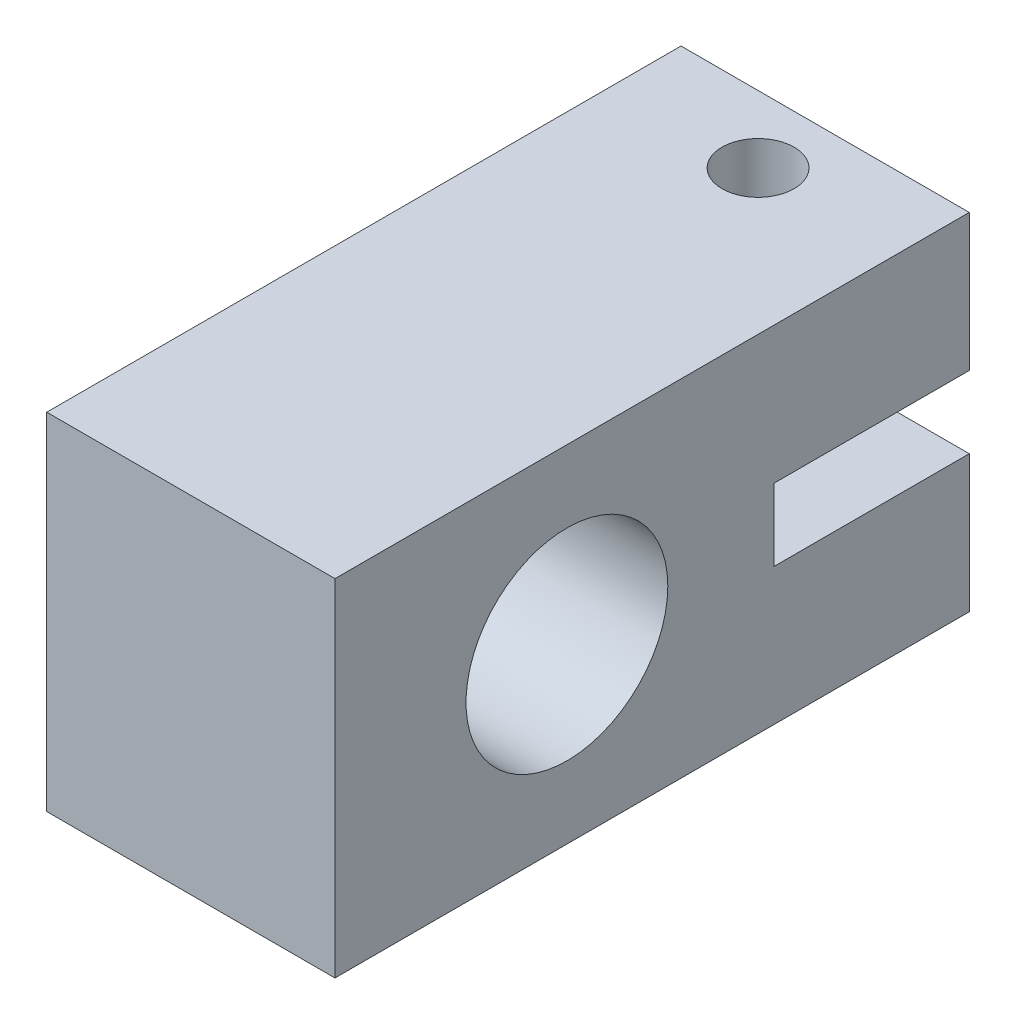
ISO-10303-21;
HEADER;
FILE_DESCRIPTION(('STEP AP214'),'2;1');
FILE_NAME('part.step','',(''),(''),'','','');
FILE_SCHEMA(('AUTOMOTIVE_DESIGN { 1 0 10303 214 1 1 1 1 }'));
ENDSEC;
DATA;
#1=APPLICATION_CONTEXT('core data for automotive mechanical design processes');
#2=APPLICATION_PROTOCOL_DEFINITION('international standard','automotive_design',2000,#1);
#3=PRODUCT_CONTEXT('',#1,'mechanical');
#4=PRODUCT('Part','Part','',(#3));
#5=PRODUCT_RELATED_PRODUCT_CATEGORY('part','',(#4));
#6=PRODUCT_DEFINITION_FORMATION('','',#4);
#7=PRODUCT_DEFINITION_CONTEXT('part definition',#1,'design');
#8=PRODUCT_DEFINITION('design','',#6,#7);
#9=PRODUCT_DEFINITION_SHAPE('','',#8);
#10=(LENGTH_UNIT() NAMED_UNIT(*) SI_UNIT(.MILLI.,.METRE.));
#11=(NAMED_UNIT(*) PLANE_ANGLE_UNIT() SI_UNIT($,.RADIAN.));
#12=(NAMED_UNIT(*) SI_UNIT($,.STERADIAN.) SOLID_ANGLE_UNIT());
#13=UNCERTAINTY_MEASURE_WITH_UNIT(LENGTH_MEASURE(1.E-05),#10,'distance_accuracy_value','');
#14=(GEOMETRIC_REPRESENTATION_CONTEXT(3) GLOBAL_UNCERTAINTY_ASSIGNED_CONTEXT((#13)) GLOBAL_UNIT_ASSIGNED_CONTEXT((#10,
#11,#12)) REPRESENTATION_CONTEXT('',''));
#15=CARTESIAN_POINT('',(0.,0.,0.));
#16=DIRECTION('',(0.,0.,1.));
#17=DIRECTION('',(1.,0.,0.));
#18=AXIS2_PLACEMENT_3D('',#15,#16,#17);
#19=CARTESIAN_POINT('',(20.,-12.,-27.9165466800982));
#20=DIRECTION('',(1.,0.,0.));
#21=DIRECTION('',(0.,0.,-1.));
#22=AXIS2_PLACEMENT_3D('',#19,#20,#21);
#23=PLANE('',#22);
#24=DIRECTION('',(0.,1.,0.));
#25=VECTOR('',#24,1.);
#26=CARTESIAN_POINT('',(20.,-2.5,-27.9165466800982));
#27=LINE('',#26,#25);
#28=CARTESIAN_POINT('',(20.,-12.,-27.9165466800982));
#29=VERTEX_POINT('',#28);
#30=CARTESIAN_POINT('',(20.,-2.5,-27.9165466800982));
#31=VERTEX_POINT('',#30);
#32=EDGE_CURVE('E143',#29,#31,#27,.T.);
#33=ORIENTED_EDGE('',*,*,#32,.T.);
#34=DIRECTION('',(0.,0.,1.));
#35=VECTOR('',#34,1.);
#36=CARTESIAN_POINT('',(20.,-2.5,-14.3714749567564));
#37=LINE('',#36,#35);
#38=CARTESIAN_POINT('',(20.,-2.5,-14.3714749567564));
#39=VERTEX_POINT('',#38);
#40=EDGE_CURVE('E91',#31,#39,#37,.T.);
#41=ORIENTED_EDGE('',*,*,#40,.T.);
#42=DIRECTION('',(0.,1.,0.));
#43=VECTOR('',#42,1.);
#44=CARTESIAN_POINT('',(20.,2.5,-14.3714749567564));
#45=LINE('',#44,#43);
#46=CARTESIAN_POINT('',(20.,2.5,-14.3714749567564));
#47=VERTEX_POINT('',#46);
#48=EDGE_CURVE('E158',#39,#47,#45,.T.);
#49=ORIENTED_EDGE('',*,*,#48,.T.);
#50=DIRECTION('',(0.,0.,-1.));
#51=VECTOR('',#50,1.);
#52=CARTESIAN_POINT('',(20.,2.5,-14.3714749567564));
#53=LINE('',#52,#51);
#54=CARTESIAN_POINT('',(20.,2.5,-27.9165466800982));
#55=VERTEX_POINT('',#54);
#56=EDGE_CURVE('E171',#47,#55,#53,.T.);
#57=ORIENTED_EDGE('',*,*,#56,.T.);
#58=DIRECTION('',(0.,1.,0.));
#59=VECTOR('',#58,1.);
#60=CARTESIAN_POINT('',(20.,12.,-27.9165466800982));
#61=LINE('',#60,#59);
#62=CARTESIAN_POINT('',(20.,12.,-27.9165466800982));
#63=VERTEX_POINT('',#62);
#64=EDGE_CURVE('E110',#55,#63,#61,.T.);
#65=ORIENTED_EDGE('',*,*,#64,.T.);
#66=DIRECTION('',(0.,0.,1.));
#67=VECTOR('',#66,1.);
#68=CARTESIAN_POINT('',(20.,12.,16.0933971814075));
#69=LINE('',#68,#67);
#70=CARTESIAN_POINT('',(20.,12.,16.0933971814075));
#71=VERTEX_POINT('',#70);
#72=EDGE_CURVE('E104',#63,#71,#69,.T.);
#73=ORIENTED_EDGE('',*,*,#72,.T.);
#74=DIRECTION('',(0.,-1.,0.));
#75=VECTOR('',#74,1.);
#76=CARTESIAN_POINT('',(20.,12.,16.0933971814075));
#77=LINE('',#76,#75);
#78=CARTESIAN_POINT('',(20.,-12.,16.0933971814075));
#79=VERTEX_POINT('',#78);
#80=EDGE_CURVE('E108',#71,#79,#77,.T.);
#81=ORIENTED_EDGE('',*,*,#80,.T.);
#82=DIRECTION('',(0.,0.,-1.));
#83=VECTOR('',#82,1.);
#84=CARTESIAN_POINT('',(20.,-12.,16.0933971814075));
#85=LINE('',#84,#83);
#86=EDGE_CURVE('E48',#79,#29,#85,.T.);
#87=ORIENTED_EDGE('',*,*,#86,.T.);
#88=EDGE_LOOP('',(#33,#41,#49,#57,#65,#73,#81,#87));
#89=FACE_BOUND('',#88,.T.);
#90=CARTESIAN_POINT('',(20.,0.,0.));
#91=DIRECTION('',(1.,0.,0.));
#92=DIRECTION('',(0.,0.,-1.));
#93=AXIS2_PLACEMENT_3D('',#90,#91,#92);
#94=CIRCLE('',#93,7.);
#95=CARTESIAN_POINT('',(20.,0.,-7.));
#96=VERTEX_POINT('',#95);
#97=EDGE_CURVE('E132',#96,#96,#94,.T.);
#98=ORIENTED_EDGE('',*,*,#97,.F.);
#99=EDGE_LOOP('',(#98));
#100=FACE_BOUND('',#99,.T.);
#101=ADVANCED_FACE('F31',(#89,#100),#23,.T.);
#102=CARTESIAN_POINT('',(0.,-12.,-27.9165466800982));
#103=DIRECTION('',(1.,0.,0.));
#104=DIRECTION('',(0.,0.,-1.));
#105=AXIS2_PLACEMENT_3D('',#102,#103,#104);
#106=PLANE('',#105);
#107=DIRECTION('',(0.,1.,0.));
#108=VECTOR('',#107,1.);
#109=CARTESIAN_POINT('',(0.,-2.5,-27.9165466800982));
#110=LINE('',#109,#108);
#111=CARTESIAN_POINT('',(0.,-12.,-27.9165466800982));
#112=VERTEX_POINT('',#111);
#113=CARTESIAN_POINT('',(0.,-2.5,-27.9165466800982));
#114=VERTEX_POINT('',#113);
#115=EDGE_CURVE('E128',#112,#114,#110,.T.);
#116=ORIENTED_EDGE('',*,*,#115,.F.);
#117=DIRECTION('',(0.,0.,-1.));
#118=VECTOR('',#117,1.);
#119=CARTESIAN_POINT('',(0.,-12.,16.0933971814075));
#120=LINE('',#119,#118);
#121=CARTESIAN_POINT('',(0.,-12.,16.0933971814075));
#122=VERTEX_POINT('',#121);
#123=EDGE_CURVE('E83',#122,#112,#120,.T.);
#124=ORIENTED_EDGE('',*,*,#123,.F.);
#125=DIRECTION('',(0.,-1.,0.));
#126=VECTOR('',#125,1.);
#127=CARTESIAN_POINT('',(0.,12.,16.0933971814075));
#128=LINE('',#127,#126);
#129=CARTESIAN_POINT('',(0.,12.,16.0933971814075));
#130=VERTEX_POINT('',#129);
#131=EDGE_CURVE('E77',#130,#122,#128,.T.);
#132=ORIENTED_EDGE('',*,*,#131,.F.);
#133=DIRECTION('',(0.,0.,1.));
#134=VECTOR('',#133,1.);
#135=CARTESIAN_POINT('',(0.,12.,16.0933971814075));
#136=LINE('',#135,#134);
#137=CARTESIAN_POINT('',(0.,12.,-27.9165466800982));
#138=VERTEX_POINT('',#137);
#139=EDGE_CURVE('E118',#138,#130,#136,.T.);
#140=ORIENTED_EDGE('',*,*,#139,.F.);
#141=DIRECTION('',(0.,1.,0.));
#142=VECTOR('',#141,1.);
#143=CARTESIAN_POINT('',(0.,12.,-27.9165466800982));
#144=LINE('',#143,#142);
#145=CARTESIAN_POINT('',(0.,2.5,-27.9165466800982));
#146=VERTEX_POINT('',#145);
#147=EDGE_CURVE('E138',#146,#138,#144,.T.);
#148=ORIENTED_EDGE('',*,*,#147,.F.);
#149=DIRECTION('',(0.,0.,-1.));
#150=VECTOR('',#149,1.);
#151=CARTESIAN_POINT('',(0.,2.5,-14.3714749567564));
#152=LINE('',#151,#150);
#153=CARTESIAN_POINT('',(0.,2.5,-14.3714749567564));
#154=VERTEX_POINT('',#153);
#155=EDGE_CURVE('E136',#154,#146,#152,.T.);
#156=ORIENTED_EDGE('',*,*,#155,.F.);
#157=DIRECTION('',(0.,1.,0.));
#158=VECTOR('',#157,1.);
#159=CARTESIAN_POINT('',(0.,2.5,-14.3714749567564));
#160=LINE('',#159,#158);
#161=CARTESIAN_POINT('',(0.,-2.5,-14.3714749567564));
#162=VERTEX_POINT('',#161);
#163=EDGE_CURVE('E134',#162,#154,#160,.T.);
#164=ORIENTED_EDGE('',*,*,#163,.F.);
#165=DIRECTION('',(0.,0.,1.));
#166=VECTOR('',#165,1.);
#167=CARTESIAN_POINT('',(0.,-2.5,-14.3714749567564));
#168=LINE('',#167,#166);
#169=EDGE_CURVE('E131',#114,#162,#168,.T.);
#170=ORIENTED_EDGE('',*,*,#169,.F.);
#171=EDGE_LOOP('',(#116,#124,#132,#140,#148,#156,#164,#170));
#172=FACE_BOUND('',#171,.T.);
#173=CARTESIAN_POINT('',(0.,0.,0.));
#174=DIRECTION('',(1.,0.,0.));
#175=DIRECTION('',(0.,0.,-1.));
#176=AXIS2_PLACEMENT_3D('',#173,#174,#175);
#177=CIRCLE('',#176,7.);
#178=CARTESIAN_POINT('',(0.,0.,-7.));
#179=VERTEX_POINT('',#178);
#180=EDGE_CURVE('E177',#179,#179,#177,.T.);
#181=ORIENTED_EDGE('',*,*,#180,.T.);
#182=EDGE_LOOP('',(#181));
#183=FACE_BOUND('',#182,.T.);
#184=ADVANCED_FACE('F162',(#172,#183),#106,.F.);
#185=CARTESIAN_POINT('',(20.,-2.5,-27.9165466800982));
#186=DIRECTION('',(0.,0.,1.));
#187=DIRECTION('',(1.,0.,0.));
#188=AXIS2_PLACEMENT_3D('',#185,#186,#187);
#189=PLANE('',#188);
#190=ORIENTED_EDGE('',*,*,#115,.T.);
#191=DIRECTION('',(-1.,0.,0.));
#192=VECTOR('',#191,1.);
#193=CARTESIAN_POINT('',(20.,-2.5,-27.9165466800982));
#194=LINE('',#193,#192);
#195=EDGE_CURVE('E11',#31,#114,#194,.T.);
#196=ORIENTED_EDGE('',*,*,#195,.F.);
#197=ORIENTED_EDGE('',*,*,#32,.F.);
#198=DIRECTION('',(-1.,0.,0.));
#199=VECTOR('',#198,1.);
#200=CARTESIAN_POINT('',(20.,-12.,-27.9165466800982));
#201=LINE('',#200,#199);
#202=EDGE_CURVE('E124',#29,#112,#201,.T.);
#203=ORIENTED_EDGE('',*,*,#202,.T.);
#204=EDGE_LOOP('',(#190,#196,#197,#203));
#205=FACE_BOUND('',#204,.T.);
#206=ADVANCED_FACE('F33',(#205),#189,.F.);
#207=CARTESIAN_POINT('',(20.,-2.5,-14.3714749567564));
#208=DIRECTION('',(0.,-1.,0.));
#209=DIRECTION('',(0.,0.,-1.));
#210=AXIS2_PLACEMENT_3D('',#207,#208,#209);
#211=PLANE('',#210);
#212=CARTESIAN_POINT('',(10.,-2.5,-23.2628310667599));
#213=DIRECTION('',(0.,-1.,0.));
#214=DIRECTION('',(0.,0.,-1.));
#215=AXIS2_PLACEMENT_3D('',#212,#213,#214);
#216=CIRCLE('',#215,2.5);
#217=CARTESIAN_POINT('',(10.,-2.5,-25.7628310667599));
#218=VERTEX_POINT('',#217);
#219=EDGE_CURVE('E180',#218,#218,#216,.T.);
#220=ORIENTED_EDGE('',*,*,#219,.T.);
#221=EDGE_LOOP('',(#220));
#222=FACE_BOUND('',#221,.T.);
#223=ORIENTED_EDGE('',*,*,#169,.T.);
#224=DIRECTION('',(-1.,0.,0.));
#225=VECTOR('',#224,1.);
#226=CARTESIAN_POINT('',(20.,-2.5,-14.3714749567564));
#227=LINE('',#226,#225);
#228=EDGE_CURVE('E40',#39,#162,#227,.T.);
#229=ORIENTED_EDGE('',*,*,#228,.F.);
#230=ORIENTED_EDGE('',*,*,#40,.F.);
#231=ORIENTED_EDGE('',*,*,#195,.T.);
#232=EDGE_LOOP('',(#223,#229,#230,#231));
#233=FACE_BOUND('',#232,.T.);
#234=ADVANCED_FACE('F205',(#222,#233),#211,.F.);
#235=CARTESIAN_POINT('',(20.,2.5,-14.3714749567564));
#236=DIRECTION('',(0.,0.,1.));
#237=DIRECTION('',(1.,0.,0.));
#238=AXIS2_PLACEMENT_3D('',#235,#236,#237);
#239=PLANE('',#238);
#240=ORIENTED_EDGE('',*,*,#163,.T.);
#241=DIRECTION('',(-1.,0.,0.));
#242=VECTOR('',#241,1.);
#243=CARTESIAN_POINT('',(20.,2.5,-14.3714749567564));
#244=LINE('',#243,#242);
#245=EDGE_CURVE('E150',#47,#154,#244,.T.);
#246=ORIENTED_EDGE('',*,*,#245,.F.);
#247=ORIENTED_EDGE('',*,*,#48,.F.);
#248=ORIENTED_EDGE('',*,*,#228,.T.);
#249=EDGE_LOOP('',(#240,#246,#247,#248));
#250=FACE_BOUND('',#249,.T.);
#251=ADVANCED_FACE('F156',(#250),#239,.F.);
#252=CARTESIAN_POINT('',(20.,2.5,-14.3714749567564));
#253=DIRECTION('',(0.,1.,0.));
#254=DIRECTION('',(0.,0.,1.));
#255=AXIS2_PLACEMENT_3D('',#252,#253,#254);
#256=PLANE('',#255);
#257=CARTESIAN_POINT('',(10.,2.5,-23.2628310667599));
#258=DIRECTION('',(0.,1.,0.));
#259=DIRECTION('',(0.,0.,1.));
#260=AXIS2_PLACEMENT_3D('',#257,#258,#259);
#261=CIRCLE('',#260,2.5);
#262=CARTESIAN_POINT('',(10.,2.5,-20.7628310667599));
#263=VERTEX_POINT('',#262);
#264=EDGE_CURVE('E185',#263,#263,#261,.T.);
#265=ORIENTED_EDGE('',*,*,#264,.T.);
#266=EDGE_LOOP('',(#265));
#267=FACE_BOUND('',#266,.T.);
#268=ORIENTED_EDGE('',*,*,#155,.T.);
#269=DIRECTION('',(-1.,0.,0.));
#270=VECTOR('',#269,1.);
#271=CARTESIAN_POINT('',(20.,2.5,-27.9165466800982));
#272=LINE('',#271,#270);
#273=EDGE_CURVE('E147',#55,#146,#272,.T.);
#274=ORIENTED_EDGE('',*,*,#273,.F.);
#275=ORIENTED_EDGE('',*,*,#56,.F.);
#276=ORIENTED_EDGE('',*,*,#245,.T.);
#277=EDGE_LOOP('',(#268,#274,#275,#276));
#278=FACE_BOUND('',#277,.T.);
#279=ADVANCED_FACE('F167',(#267,#278),#256,.F.);
#280=CARTESIAN_POINT('',(20.,12.,-27.9165466800982));
#281=DIRECTION('',(0.,0.,1.));
#282=DIRECTION('',(1.,0.,0.));
#283=AXIS2_PLACEMENT_3D('',#280,#281,#282);
#284=PLANE('',#283);
#285=ORIENTED_EDGE('',*,*,#147,.T.);
#286=DIRECTION('',(-1.,0.,0.));
#287=VECTOR('',#286,1.);
#288=CARTESIAN_POINT('',(20.,12.,-27.9165466800982));
#289=LINE('',#288,#287);
#290=EDGE_CURVE('E119',#63,#138,#289,.T.);
#291=ORIENTED_EDGE('',*,*,#290,.F.);
#292=ORIENTED_EDGE('',*,*,#64,.F.);
#293=ORIENTED_EDGE('',*,*,#273,.T.);
#294=EDGE_LOOP('',(#285,#291,#292,#293));
#295=FACE_BOUND('',#294,.T.);
#296=ADVANCED_FACE('F170',(#295),#284,.F.);
#297=CARTESIAN_POINT('',(20.,12.,16.0933971814075));
#298=DIRECTION('',(0.,-1.,0.));
#299=DIRECTION('',(0.,0.,-1.));
#300=AXIS2_PLACEMENT_3D('',#297,#298,#299);
#301=PLANE('',#300);
#302=CARTESIAN_POINT('',(10.,12.,-23.2628310667599));
#303=DIRECTION('',(0.,1.,0.));
#304=DIRECTION('',(0.,0.,1.));
#305=AXIS2_PLACEMENT_3D('',#302,#303,#304);
#306=CIRCLE('',#305,2.5);
#307=CARTESIAN_POINT('',(10.,12.,-20.7628310667599));
#308=VERTEX_POINT('',#307);
#309=EDGE_CURVE('E189',#308,#308,#306,.T.);
#310=ORIENTED_EDGE('',*,*,#309,.F.);
#311=EDGE_LOOP('',(#310));
#312=FACE_BOUND('',#311,.T.);
#313=ORIENTED_EDGE('',*,*,#139,.T.);
#314=DIRECTION('',(-1.,0.,0.));
#315=VECTOR('',#314,1.);
#316=CARTESIAN_POINT('',(20.,12.,16.0933971814075));
#317=LINE('',#316,#315);
#318=EDGE_CURVE('E115',#71,#130,#317,.T.);
#319=ORIENTED_EDGE('',*,*,#318,.F.);
#320=ORIENTED_EDGE('',*,*,#72,.F.);
#321=ORIENTED_EDGE('',*,*,#290,.T.);
#322=EDGE_LOOP('',(#313,#319,#320,#321));
#323=FACE_BOUND('',#322,.T.);
#324=ADVANCED_FACE('F116',(#312,#323),#301,.F.);
#325=CARTESIAN_POINT('',(20.,12.,16.0933971814075));
#326=DIRECTION('',(0.,0.,-1.));
#327=DIRECTION('',(0.,1.,0.));
#328=AXIS2_PLACEMENT_3D('',#325,#326,#327);
#329=PLANE('',#328);
#330=ORIENTED_EDGE('',*,*,#131,.T.);
#331=DIRECTION('',(-1.,0.,0.));
#332=VECTOR('',#331,1.);
#333=CARTESIAN_POINT('',(20.,-12.,16.0933971814075));
#334=LINE('',#333,#332);
#335=EDGE_CURVE('E120',#79,#122,#334,.T.);
#336=ORIENTED_EDGE('',*,*,#335,.F.);
#337=ORIENTED_EDGE('',*,*,#80,.F.);
#338=ORIENTED_EDGE('',*,*,#318,.T.);
#339=EDGE_LOOP('',(#330,#336,#337,#338));
#340=FACE_BOUND('',#339,.T.);
#341=ADVANCED_FACE('F122',(#340),#329,.F.);
#342=CARTESIAN_POINT('',(20.,-12.,16.0933971814075));
#343=DIRECTION('',(0.,1.,0.));
#344=DIRECTION('',(0.,0.,1.));
#345=AXIS2_PLACEMENT_3D('',#342,#343,#344);
#346=PLANE('',#345);
#347=CARTESIAN_POINT('',(10.,-12.,-23.2628310667599));
#348=DIRECTION('',(0.,1.,0.));
#349=DIRECTION('',(0.,0.,1.));
#350=AXIS2_PLACEMENT_3D('',#347,#348,#349);
#351=CIRCLE('',#350,2.5);
#352=CARTESIAN_POINT('',(10.,-12.,-20.7628310667599));
#353=VERTEX_POINT('',#352);
#354=EDGE_CURVE('E188',#353,#353,#351,.T.);
#355=ORIENTED_EDGE('',*,*,#354,.T.);
#356=EDGE_LOOP('',(#355));
#357=FACE_BOUND('',#356,.T.);
#358=ORIENTED_EDGE('',*,*,#123,.T.);
#359=ORIENTED_EDGE('',*,*,#202,.F.);
#360=ORIENTED_EDGE('',*,*,#86,.F.);
#361=ORIENTED_EDGE('',*,*,#335,.T.);
#362=EDGE_LOOP('',(#358,#359,#360,#361));
#363=FACE_BOUND('',#362,.T.);
#364=ADVANCED_FACE('F195',(#357,#363),#346,.F.);
#365=CARTESIAN_POINT('',(20.,0.,0.));
#366=DIRECTION('',(-1.,0.,0.));
#367=DIRECTION('',(0.,0.,1.));
#368=AXIS2_PLACEMENT_3D('',#365,#366,#367);
#369=CYLINDRICAL_SURFACE('',#368,7.);
#370=ORIENTED_EDGE('',*,*,#97,.T.);
#371=EDGE_LOOP('',(#370));
#372=FACE_BOUND('',#371,.T.);
#373=ORIENTED_EDGE('',*,*,#180,.F.);
#374=EDGE_LOOP('',(#373));
#375=FACE_BOUND('',#374,.T.);
#376=ADVANCED_FACE('F201',(#372,#375),#369,.F.);
#377=CARTESIAN_POINT('',(10.,-12.,-23.2628310667599));
#378=DIRECTION('',(0.,1.,0.));
#379=DIRECTION('',(0.,0.,1.));
#380=AXIS2_PLACEMENT_3D('',#377,#378,#379);
#381=CYLINDRICAL_SURFACE('',#380,2.5);
#382=ORIENTED_EDGE('',*,*,#354,.F.);
#383=EDGE_LOOP('',(#382));
#384=FACE_BOUND('',#383,.T.);
#385=ORIENTED_EDGE('',*,*,#219,.F.);
#386=EDGE_LOOP('',(#385));
#387=FACE_BOUND('',#386,.T.);
#388=ADVANCED_FACE('F197',(#384,#387),#381,.F.);
#389=ORIENTED_EDGE('',*,*,#309,.T.);
#390=EDGE_LOOP('',(#389));
#391=FACE_BOUND('',#390,.T.);
#392=ORIENTED_EDGE('',*,*,#264,.F.);
#393=EDGE_LOOP('',(#392));
#394=FACE_BOUND('',#393,.T.);
#395=ADVANCED_FACE('F200',(#391,#394),#381,.F.);
#396=CLOSED_SHELL('',(#101,#184,#206,#234,#251,#279,#296,#324,#341,#364,#376,#388,#395));
#397=MANIFOLD_SOLID_BREP('B2',#396);
#398=ADVANCED_BREP_SHAPE_REPRESENTATION('',(#18,#397),#14);
#399=SHAPE_DEFINITION_REPRESENTATION(#9,#398);
ENDSEC;
END-ISO-10303-21;
